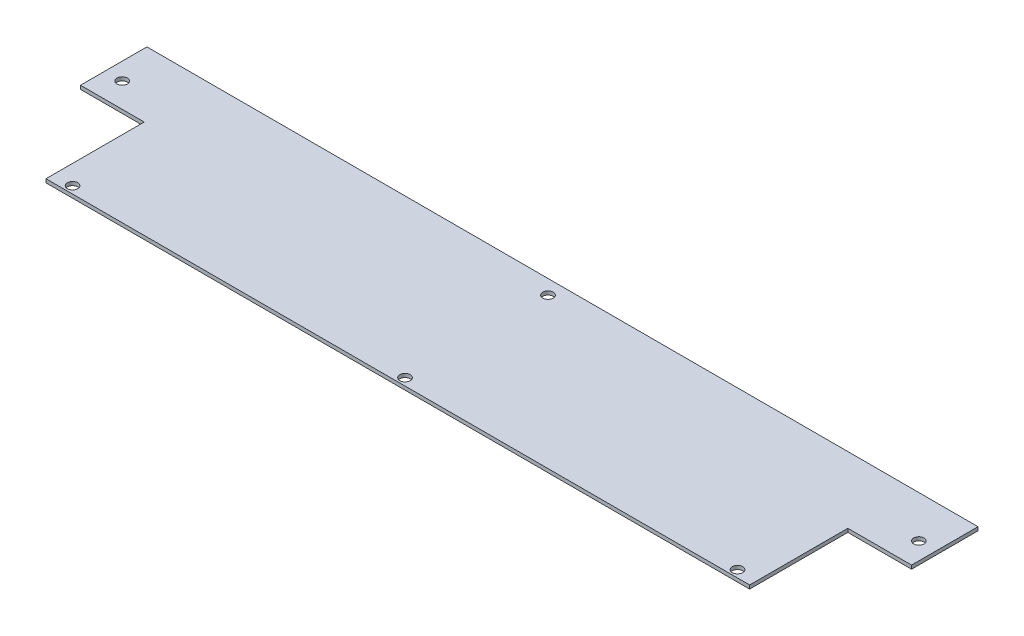
ISO-10303-21;
HEADER;
FILE_DESCRIPTION(('STEP AP214'),'2;1');
FILE_NAME('part.step','',(''),(''),'','','');
FILE_SCHEMA(('AUTOMOTIVE_DESIGN { 1 0 10303 214 1 1 1 1 }'));
ENDSEC;
DATA;
#1=APPLICATION_CONTEXT('core data for automotive mechanical design processes');
#2=APPLICATION_PROTOCOL_DEFINITION('international standard','automotive_design',2000,#1);
#3=PRODUCT_CONTEXT('',#1,'mechanical');
#4=PRODUCT('Part','Part','',(#3));
#5=PRODUCT_RELATED_PRODUCT_CATEGORY('part','',(#4));
#6=PRODUCT_DEFINITION_FORMATION('','',#4);
#7=PRODUCT_DEFINITION_CONTEXT('part definition',#1,'design');
#8=PRODUCT_DEFINITION('design','',#6,#7);
#9=PRODUCT_DEFINITION_SHAPE('','',#8);
#10=(LENGTH_UNIT() NAMED_UNIT(*) SI_UNIT(.MILLI.,.METRE.));
#11=(NAMED_UNIT(*) PLANE_ANGLE_UNIT() SI_UNIT($,.RADIAN.));
#12=(NAMED_UNIT(*) SI_UNIT($,.STERADIAN.) SOLID_ANGLE_UNIT());
#13=UNCERTAINTY_MEASURE_WITH_UNIT(LENGTH_MEASURE(1.E-05),#10,'distance_accuracy_value','');
#14=(GEOMETRIC_REPRESENTATION_CONTEXT(3) GLOBAL_UNCERTAINTY_ASSIGNED_CONTEXT((#13)) GLOBAL_UNIT_ASSIGNED_CONTEXT((#10,
#11,#12)) REPRESENTATION_CONTEXT('',''));
#15=CARTESIAN_POINT('',(0.,0.,0.));
#16=DIRECTION('',(0.,0.,1.));
#17=DIRECTION('',(1.,0.,0.));
#18=AXIS2_PLACEMENT_3D('',#15,#16,#17);
#19=CARTESIAN_POINT('',(0.,1.5875,0.));
#20=DIRECTION('',(0.,-1.,0.));
#21=DIRECTION('',(0.,0.,-1.));
#22=AXIS2_PLACEMENT_3D('',#19,#20,#21);
#23=PLANE('',#22);
#24=DIRECTION('',(0.,0.,1.));
#25=VECTOR('',#24,1.);
#26=CARTESIAN_POINT('',(-182.708271591409,1.5875,-36.195));
#27=LINE('',#26,#25);
#28=CARTESIAN_POINT('',(-182.708271591409,1.5875,-36.195));
#29=VERTEX_POINT('',#28);
#30=CARTESIAN_POINT('',(-182.708271591409,1.5875,-6.98499999999999));
#31=VERTEX_POINT('',#30);
#32=EDGE_CURVE('E168',#29,#31,#27,.T.);
#33=ORIENTED_EDGE('',*,*,#32,.T.);
#34=DIRECTION('',(1.,0.,0.));
#35=VECTOR('',#34,1.);
#36=CARTESIAN_POINT('',(-154.686,1.5875,-6.98499999999999));
#37=LINE('',#36,#35);
#38=CARTESIAN_POINT('',(-154.686,1.5875,-6.98499999999999));
#39=VERTEX_POINT('',#38);
#40=EDGE_CURVE('E104',#31,#39,#37,.T.);
#41=ORIENTED_EDGE('',*,*,#40,.T.);
#42=DIRECTION('',(0.,0.,1.));
#43=VECTOR('',#42,1.);
#44=CARTESIAN_POINT('',(-154.686,1.5875,36.195));
#45=LINE('',#44,#43);
#46=CARTESIAN_POINT('',(-154.686,1.5875,36.195));
#47=VERTEX_POINT('',#46);
#48=EDGE_CURVE('E189',#39,#47,#45,.T.);
#49=ORIENTED_EDGE('',*,*,#48,.T.);
#50=DIRECTION('',(1.,0.,0.));
#51=VECTOR('',#50,1.);
#52=CARTESIAN_POINT('',(154.686,1.5875,36.195));
#53=LINE('',#52,#51);
#54=CARTESIAN_POINT('',(154.686,1.5875,36.195));
#55=VERTEX_POINT('',#54);
#56=EDGE_CURVE('E203',#47,#55,#53,.T.);
#57=ORIENTED_EDGE('',*,*,#56,.T.);
#58=DIRECTION('',(0.,0.,-1.));
#59=VECTOR('',#58,1.);
#60=CARTESIAN_POINT('',(154.686,1.5875,36.195));
#61=LINE('',#60,#59);
#62=CARTESIAN_POINT('',(154.686,1.5875,-6.98499999999999));
#63=VERTEX_POINT('',#62);
#64=EDGE_CURVE('E123',#55,#63,#61,.T.);
#65=ORIENTED_EDGE('',*,*,#64,.T.);
#66=DIRECTION('',(1.,0.,0.));
#67=VECTOR('',#66,1.);
#68=CARTESIAN_POINT('',(182.70827159141,1.5875,-6.98499999999999));
#69=LINE('',#68,#67);
#70=CARTESIAN_POINT('',(182.70827159141,1.5875,-6.98499999999999));
#71=VERTEX_POINT('',#70);
#72=EDGE_CURVE('E117',#63,#71,#69,.T.);
#73=ORIENTED_EDGE('',*,*,#72,.T.);
#74=DIRECTION('',(0.,0.,-1.));
#75=VECTOR('',#74,1.);
#76=CARTESIAN_POINT('',(182.70827159141,1.5875,-36.1950000000001));
#77=LINE('',#76,#75);
#78=CARTESIAN_POINT('',(182.70827159141,1.5875,-36.1950000000001));
#79=VERTEX_POINT('',#78);
#80=EDGE_CURVE('E121',#71,#79,#77,.T.);
#81=ORIENTED_EDGE('',*,*,#80,.T.);
#82=DIRECTION('',(-1.,0.,0.));
#83=VECTOR('',#82,1.);
#84=CARTESIAN_POINT('',(-182.708271591409,1.5875,-36.195));
#85=LINE('',#84,#83);
#86=EDGE_CURVE('E61',#79,#29,#85,.T.);
#87=ORIENTED_EDGE('',*,*,#86,.T.);
#88=EDGE_LOOP('',(#33,#41,#49,#57,#65,#73,#81,#87));
#89=FACE_BOUND('',#88,.T.);
#90=CARTESIAN_POINT('',(175.1457,1.5875,-17.7800000000001));
#91=DIRECTION('',(0.,1.,0.));
#92=DIRECTION('',(0.,0.,1.));
#93=AXIS2_PLACEMENT_3D('',#90,#91,#92);
#94=CIRCLE('',#93,2.28600000000001);
#95=CARTESIAN_POINT('',(175.1457,1.5875,-15.494));
#96=VERTEX_POINT('',#95);
#97=EDGE_CURVE('E150',#96,#96,#94,.T.);
#98=ORIENTED_EDGE('',*,*,#97,.F.);
#99=EDGE_LOOP('',(#98));
#100=FACE_BOUND('',#99,.T.);
#101=CARTESIAN_POINT('',(0.,1.5875,-29.845));
#102=DIRECTION('',(0.,1.,0.));
#103=DIRECTION('',(0.,0.,1.));
#104=AXIS2_PLACEMENT_3D('',#101,#102,#103);
#105=CIRCLE('',#104,2.28599999999997);
#106=CARTESIAN_POINT('',(0.,1.5875,-27.559));
#107=VERTEX_POINT('',#106);
#108=EDGE_CURVE('E217',#107,#107,#105,.T.);
#109=ORIENTED_EDGE('',*,*,#108,.F.);
#110=EDGE_LOOP('',(#109));
#111=FACE_BOUND('',#110,.T.);
#112=CARTESIAN_POINT('',(-175.1457,1.5875,-17.78));
#113=DIRECTION('',(0.,1.,0.));
#114=DIRECTION('',(0.,0.,1.));
#115=AXIS2_PLACEMENT_3D('',#112,#113,#114);
#116=CIRCLE('',#115,2.28600000000001);
#117=CARTESIAN_POINT('',(-175.1457,1.5875,-15.494));
#118=VERTEX_POINT('',#117);
#119=EDGE_CURVE('E225',#118,#118,#116,.T.);
#120=ORIENTED_EDGE('',*,*,#119,.F.);
#121=EDGE_LOOP('',(#120));
#122=FACE_BOUND('',#121,.T.);
#123=CARTESIAN_POINT('',(0.,1.5875,33.02));
#124=DIRECTION('',(0.,1.,0.));
#125=DIRECTION('',(0.,0.,1.));
#126=AXIS2_PLACEMENT_3D('',#123,#124,#125);
#127=CIRCLE('',#126,2.28599999999998);
#128=CARTESIAN_POINT('',(0.,1.5875,35.306));
#129=VERTEX_POINT('',#128);
#130=EDGE_CURVE('E233',#129,#129,#127,.T.);
#131=ORIENTED_EDGE('',*,*,#130,.F.);
#132=EDGE_LOOP('',(#131));
#133=FACE_BOUND('',#132,.T.);
#134=CARTESIAN_POINT('',(-146.177,1.5875,33.02));
#135=DIRECTION('',(0.,1.,0.));
#136=DIRECTION('',(0.,0.,1.));
#137=AXIS2_PLACEMENT_3D('',#134,#135,#136);
#138=CIRCLE('',#137,2.28600000000001);
#139=CARTESIAN_POINT('',(-146.177,1.5875,35.306));
#140=VERTEX_POINT('',#139);
#141=EDGE_CURVE('E241',#140,#140,#138,.T.);
#142=ORIENTED_EDGE('',*,*,#141,.F.);
#143=EDGE_LOOP('',(#142));
#144=FACE_BOUND('',#143,.T.);
#145=CARTESIAN_POINT('',(146.177,1.5875,33.02));
#146=DIRECTION('',(0.,1.,0.));
#147=DIRECTION('',(0.,0.,1.));
#148=AXIS2_PLACEMENT_3D('',#145,#146,#147);
#149=CIRCLE('',#148,2.28600000000001);
#150=CARTESIAN_POINT('',(146.177,1.5875,35.306));
#151=VERTEX_POINT('',#150);
#152=EDGE_CURVE('E249',#151,#151,#149,.T.);
#153=ORIENTED_EDGE('',*,*,#152,.F.);
#154=EDGE_LOOP('',(#153));
#155=FACE_BOUND('',#154,.T.);
#156=ADVANCED_FACE('F43',(#89,#100,#111,#122,#133,#144,#155),#23,.F.);
#157=CARTESIAN_POINT('',(0.,0.,0.));
#158=DIRECTION('',(0.,-1.,0.));
#159=DIRECTION('',(0.,0.,-1.));
#160=AXIS2_PLACEMENT_3D('',#157,#158,#159);
#161=PLANE('',#160);
#162=CARTESIAN_POINT('',(-146.177,0.,33.02));
#163=DIRECTION('',(0.,1.,0.));
#164=DIRECTION('',(0.,0.,1.));
#165=AXIS2_PLACEMENT_3D('',#162,#163,#164);
#166=CIRCLE('',#165,2.28600000000001);
#167=CARTESIAN_POINT('',(-146.177,0.,35.306));
#168=VERTEX_POINT('',#167);
#169=EDGE_CURVE('E245',#168,#168,#166,.T.);
#170=ORIENTED_EDGE('',*,*,#169,.T.);
#171=EDGE_LOOP('',(#170));
#172=FACE_BOUND('',#171,.T.);
#173=CARTESIAN_POINT('',(-175.1457,0.,-17.78));
#174=DIRECTION('',(0.,1.,0.));
#175=DIRECTION('',(0.,0.,1.));
#176=AXIS2_PLACEMENT_3D('',#173,#174,#175);
#177=CIRCLE('',#176,2.28600000000001);
#178=CARTESIAN_POINT('',(-175.1457,0.,-15.494));
#179=VERTEX_POINT('',#178);
#180=EDGE_CURVE('E229',#179,#179,#177,.T.);
#181=ORIENTED_EDGE('',*,*,#180,.T.);
#182=EDGE_LOOP('',(#181));
#183=FACE_BOUND('',#182,.T.);
#184=CARTESIAN_POINT('',(175.1457,0.,-17.7800000000001));
#185=DIRECTION('',(0.,1.,0.));
#186=DIRECTION('',(0.,0.,1.));
#187=AXIS2_PLACEMENT_3D('',#184,#185,#186);
#188=CIRCLE('',#187,2.28600000000001);
#189=CARTESIAN_POINT('',(175.1457,0.,-15.494));
#190=VERTEX_POINT('',#189);
#191=EDGE_CURVE('E213',#190,#190,#188,.T.);
#192=ORIENTED_EDGE('',*,*,#191,.T.);
#193=EDGE_LOOP('',(#192));
#194=FACE_BOUND('',#193,.T.);
#195=DIRECTION('',(0.,0.,1.));
#196=VECTOR('',#195,1.);
#197=CARTESIAN_POINT('',(-182.708271591409,0.,-36.195));
#198=LINE('',#197,#196);
#199=CARTESIAN_POINT('',(-182.708271591409,0.,-36.195));
#200=VERTEX_POINT('',#199);
#201=CARTESIAN_POINT('',(-182.708271591409,0.,-6.98499999999999));
#202=VERTEX_POINT('',#201);
#203=EDGE_CURVE('E145',#200,#202,#198,.T.);
#204=ORIENTED_EDGE('',*,*,#203,.F.);
#205=DIRECTION('',(-1.,0.,0.));
#206=VECTOR('',#205,1.);
#207=CARTESIAN_POINT('',(-182.708271591409,0.,-36.195));
#208=LINE('',#207,#206);
#209=CARTESIAN_POINT('',(182.70827159141,0.,-36.1950000000001));
#210=VERTEX_POINT('',#209);
#211=EDGE_CURVE('E96',#210,#200,#208,.T.);
#212=ORIENTED_EDGE('',*,*,#211,.F.);
#213=DIRECTION('',(0.,0.,-1.));
#214=VECTOR('',#213,1.);
#215=CARTESIAN_POINT('',(182.70827159141,0.,-36.1950000000001));
#216=LINE('',#215,#214);
#217=CARTESIAN_POINT('',(182.70827159141,0.,-6.98499999999999));
#218=VERTEX_POINT('',#217);
#219=EDGE_CURVE('E90',#218,#210,#216,.T.);
#220=ORIENTED_EDGE('',*,*,#219,.F.);
#221=DIRECTION('',(1.,0.,0.));
#222=VECTOR('',#221,1.);
#223=CARTESIAN_POINT('',(182.70827159141,0.,-6.98499999999999));
#224=LINE('',#223,#222);
#225=CARTESIAN_POINT('',(154.686,0.,-6.98499999999999));
#226=VERTEX_POINT('',#225);
#227=EDGE_CURVE('E132',#226,#218,#224,.T.);
#228=ORIENTED_EDGE('',*,*,#227,.F.);
#229=DIRECTION('',(0.,0.,-1.));
#230=VECTOR('',#229,1.);
#231=CARTESIAN_POINT('',(154.686,0.,36.195));
#232=LINE('',#231,#230);
#233=CARTESIAN_POINT('',(154.686,0.,36.195));
#234=VERTEX_POINT('',#233);
#235=EDGE_CURVE('E159',#234,#226,#232,.T.);
#236=ORIENTED_EDGE('',*,*,#235,.F.);
#237=DIRECTION('',(1.,0.,0.));
#238=VECTOR('',#237,1.);
#239=CARTESIAN_POINT('',(154.686,0.,36.195));
#240=LINE('',#239,#238);
#241=CARTESIAN_POINT('',(-154.686,0.,36.195));
#242=VERTEX_POINT('',#241);
#243=EDGE_CURVE('E156',#242,#234,#240,.T.);
#244=ORIENTED_EDGE('',*,*,#243,.F.);
#245=DIRECTION('',(0.,0.,1.));
#246=VECTOR('',#245,1.);
#247=CARTESIAN_POINT('',(-154.686,0.,36.195));
#248=LINE('',#247,#246);
#249=CARTESIAN_POINT('',(-154.686,0.,-6.98499999999999));
#250=VERTEX_POINT('',#249);
#251=EDGE_CURVE('E153',#250,#242,#248,.T.);
#252=ORIENTED_EDGE('',*,*,#251,.F.);
#253=DIRECTION('',(1.,0.,0.));
#254=VECTOR('',#253,1.);
#255=CARTESIAN_POINT('',(-154.686,0.,-6.98499999999999));
#256=LINE('',#255,#254);
#257=EDGE_CURVE('E149',#202,#250,#256,.T.);
#258=ORIENTED_EDGE('',*,*,#257,.F.);
#259=EDGE_LOOP('',(#204,#212,#220,#228,#236,#244,#252,#258));
#260=FACE_BOUND('',#259,.T.);
#261=CARTESIAN_POINT('',(0.,0.,-29.845));
#262=DIRECTION('',(0.,1.,0.));
#263=DIRECTION('',(0.,0.,1.));
#264=AXIS2_PLACEMENT_3D('',#261,#262,#263);
#265=CIRCLE('',#264,2.28599999999997);
#266=CARTESIAN_POINT('',(0.,0.,-27.559));
#267=VERTEX_POINT('',#266);
#268=EDGE_CURVE('E221',#267,#267,#265,.T.);
#269=ORIENTED_EDGE('',*,*,#268,.T.);
#270=EDGE_LOOP('',(#269));
#271=FACE_BOUND('',#270,.T.);
#272=CARTESIAN_POINT('',(0.,0.,33.02));
#273=DIRECTION('',(0.,1.,0.));
#274=DIRECTION('',(0.,0.,1.));
#275=AXIS2_PLACEMENT_3D('',#272,#273,#274);
#276=CIRCLE('',#275,2.28599999999998);
#277=CARTESIAN_POINT('',(0.,0.,35.306));
#278=VERTEX_POINT('',#277);
#279=EDGE_CURVE('E237',#278,#278,#276,.T.);
#280=ORIENTED_EDGE('',*,*,#279,.T.);
#281=EDGE_LOOP('',(#280));
#282=FACE_BOUND('',#281,.T.);
#283=CARTESIAN_POINT('',(146.177,0.,33.02));
#284=DIRECTION('',(0.,1.,0.));
#285=DIRECTION('',(0.,0.,1.));
#286=AXIS2_PLACEMENT_3D('',#283,#284,#285);
#287=CIRCLE('',#286,2.28600000000001);
#288=CARTESIAN_POINT('',(146.177,0.,35.306));
#289=VERTEX_POINT('',#288);
#290=EDGE_CURVE('E253',#289,#289,#287,.T.);
#291=ORIENTED_EDGE('',*,*,#290,.T.);
#292=EDGE_LOOP('',(#291));
#293=FACE_BOUND('',#292,.T.);
#294=ADVANCED_FACE('F193',(#172,#183,#194,#260,#271,#282,#293),#161,.T.);
#295=CARTESIAN_POINT('',(-182.708271591409,1.5875,-36.195));
#296=DIRECTION('',(1.,0.,0.));
#297=DIRECTION('',(0.,0.,-1.));
#298=AXIS2_PLACEMENT_3D('',#295,#296,#297);
#299=PLANE('',#298);
#300=ORIENTED_EDGE('',*,*,#203,.T.);
#301=DIRECTION('',(0.,-1.,0.));
#302=VECTOR('',#301,1.);
#303=CARTESIAN_POINT('',(-182.708271591409,1.5875,-6.98499999999999));
#304=LINE('',#303,#302);
#305=EDGE_CURVE('E11',#31,#202,#304,.T.);
#306=ORIENTED_EDGE('',*,*,#305,.F.);
#307=ORIENTED_EDGE('',*,*,#32,.F.);
#308=DIRECTION('',(0.,-1.,0.));
#309=VECTOR('',#308,1.);
#310=CARTESIAN_POINT('',(-182.708271591409,1.5875,-36.195));
#311=LINE('',#310,#309);
#312=EDGE_CURVE('E141',#29,#200,#311,.T.);
#313=ORIENTED_EDGE('',*,*,#312,.T.);
#314=EDGE_LOOP('',(#300,#306,#307,#313));
#315=FACE_BOUND('',#314,.T.);
#316=ADVANCED_FACE('F45',(#315),#299,.F.);
#317=CARTESIAN_POINT('',(-154.686,1.5875,-6.98499999999999));
#318=DIRECTION('',(0.,0.,-1.));
#319=DIRECTION('',(-1.,0.,0.));
#320=AXIS2_PLACEMENT_3D('',#317,#318,#319);
#321=PLANE('',#320);
#322=ORIENTED_EDGE('',*,*,#257,.T.);
#323=DIRECTION('',(0.,-1.,0.));
#324=VECTOR('',#323,1.);
#325=CARTESIAN_POINT('',(-154.686,1.5875,-6.98499999999999));
#326=LINE('',#325,#324);
#327=EDGE_CURVE('E53',#39,#250,#326,.T.);
#328=ORIENTED_EDGE('',*,*,#327,.F.);
#329=ORIENTED_EDGE('',*,*,#40,.F.);
#330=ORIENTED_EDGE('',*,*,#305,.T.);
#331=EDGE_LOOP('',(#322,#328,#329,#330));
#332=FACE_BOUND('',#331,.T.);
#333=ADVANCED_FACE('F287',(#332),#321,.F.);
#334=CARTESIAN_POINT('',(-154.686,1.5875,36.195));
#335=DIRECTION('',(1.,0.,0.));
#336=DIRECTION('',(0.,0.,-1.));
#337=AXIS2_PLACEMENT_3D('',#334,#335,#336);
#338=PLANE('',#337);
#339=ORIENTED_EDGE('',*,*,#251,.T.);
#340=DIRECTION('',(0.,-1.,0.));
#341=VECTOR('',#340,1.);
#342=CARTESIAN_POINT('',(-154.686,1.5875,36.195));
#343=LINE('',#342,#341);
#344=EDGE_CURVE('E179',#47,#242,#343,.T.);
#345=ORIENTED_EDGE('',*,*,#344,.F.);
#346=ORIENTED_EDGE('',*,*,#48,.F.);
#347=ORIENTED_EDGE('',*,*,#327,.T.);
#348=EDGE_LOOP('',(#339,#345,#346,#347));
#349=FACE_BOUND('',#348,.T.);
#350=ADVANCED_FACE('F187',(#349),#338,.F.);
#351=CARTESIAN_POINT('',(154.686,1.5875,36.195));
#352=DIRECTION('',(0.,0.,-1.));
#353=DIRECTION('',(-1.,0.,0.));
#354=AXIS2_PLACEMENT_3D('',#351,#352,#353);
#355=PLANE('',#354);
#356=ORIENTED_EDGE('',*,*,#243,.T.);
#357=DIRECTION('',(0.,-1.,0.));
#358=VECTOR('',#357,1.);
#359=CARTESIAN_POINT('',(154.686,1.5875,36.195));
#360=LINE('',#359,#358);
#361=EDGE_CURVE('E175',#55,#234,#360,.T.);
#362=ORIENTED_EDGE('',*,*,#361,.F.);
#363=ORIENTED_EDGE('',*,*,#56,.F.);
#364=ORIENTED_EDGE('',*,*,#344,.T.);
#365=EDGE_LOOP('',(#356,#362,#363,#364));
#366=FACE_BOUND('',#365,.T.);
#367=ADVANCED_FACE('F198',(#366),#355,.F.);
#368=CARTESIAN_POINT('',(154.686,1.5875,36.195));
#369=DIRECTION('',(-1.,0.,0.));
#370=DIRECTION('',(0.,0.,1.));
#371=AXIS2_PLACEMENT_3D('',#368,#369,#370);
#372=PLANE('',#371);
#373=ORIENTED_EDGE('',*,*,#235,.T.);
#374=DIRECTION('',(0.,-1.,0.));
#375=VECTOR('',#374,1.);
#376=CARTESIAN_POINT('',(154.686,1.5875,-6.98499999999999));
#377=LINE('',#376,#375);
#378=EDGE_CURVE('E134',#63,#226,#377,.T.);
#379=ORIENTED_EDGE('',*,*,#378,.F.);
#380=ORIENTED_EDGE('',*,*,#64,.F.);
#381=ORIENTED_EDGE('',*,*,#361,.T.);
#382=EDGE_LOOP('',(#373,#379,#380,#381));
#383=FACE_BOUND('',#382,.T.);
#384=ADVANCED_FACE('F201',(#383),#372,.F.);
#385=CARTESIAN_POINT('',(182.70827159141,1.5875,-6.98499999999999));
#386=DIRECTION('',(0.,0.,-1.));
#387=DIRECTION('',(-1.,0.,0.));
#388=AXIS2_PLACEMENT_3D('',#385,#386,#387);
#389=PLANE('',#388);
#390=ORIENTED_EDGE('',*,*,#227,.T.);
#391=DIRECTION('',(0.,-1.,0.));
#392=VECTOR('',#391,1.);
#393=CARTESIAN_POINT('',(182.70827159141,1.5875,-6.98499999999999));
#394=LINE('',#393,#392);
#395=EDGE_CURVE('E129',#71,#218,#394,.T.);
#396=ORIENTED_EDGE('',*,*,#395,.F.);
#397=ORIENTED_EDGE('',*,*,#72,.F.);
#398=ORIENTED_EDGE('',*,*,#378,.T.);
#399=EDGE_LOOP('',(#390,#396,#397,#398));
#400=FACE_BOUND('',#399,.T.);
#401=ADVANCED_FACE('F130',(#400),#389,.F.);
#402=CARTESIAN_POINT('',(182.70827159141,1.5875,-36.1950000000001));
#403=DIRECTION('',(-1.,0.,0.));
#404=DIRECTION('',(0.,0.,1.));
#405=AXIS2_PLACEMENT_3D('',#402,#403,#404);
#406=PLANE('',#405);
#407=ORIENTED_EDGE('',*,*,#219,.T.);
#408=DIRECTION('',(0.,-1.,0.));
#409=VECTOR('',#408,1.);
#410=CARTESIAN_POINT('',(182.70827159141,1.5875,-36.1950000000001));
#411=LINE('',#410,#409);
#412=EDGE_CURVE('E135',#79,#210,#411,.T.);
#413=ORIENTED_EDGE('',*,*,#412,.F.);
#414=ORIENTED_EDGE('',*,*,#80,.F.);
#415=ORIENTED_EDGE('',*,*,#395,.T.);
#416=EDGE_LOOP('',(#407,#413,#414,#415));
#417=FACE_BOUND('',#416,.T.);
#418=ADVANCED_FACE('F137',(#417),#406,.F.);
#419=CARTESIAN_POINT('',(-182.708271591409,1.5875,-36.195));
#420=DIRECTION('',(0.,0.,1.));
#421=DIRECTION('',(1.,0.,0.));
#422=AXIS2_PLACEMENT_3D('',#419,#420,#421);
#423=PLANE('',#422);
#424=ORIENTED_EDGE('',*,*,#211,.T.);
#425=ORIENTED_EDGE('',*,*,#312,.F.);
#426=ORIENTED_EDGE('',*,*,#86,.F.);
#427=ORIENTED_EDGE('',*,*,#412,.T.);
#428=EDGE_LOOP('',(#424,#425,#426,#427));
#429=FACE_BOUND('',#428,.T.);
#430=ADVANCED_FACE('F275',(#429),#423,.F.);
#431=CARTESIAN_POINT('',(175.1457,1.5875,-17.7800000000001));
#432=DIRECTION('',(0.,-1.,0.));
#433=DIRECTION('',(0.,0.,-1.));
#434=AXIS2_PLACEMENT_3D('',#431,#432,#433);
#435=CYLINDRICAL_SURFACE('',#434,2.28600000000001);
#436=ORIENTED_EDGE('',*,*,#97,.T.);
#437=EDGE_LOOP('',(#436));
#438=FACE_BOUND('',#437,.T.);
#439=ORIENTED_EDGE('',*,*,#191,.F.);
#440=EDGE_LOOP('',(#439));
#441=FACE_BOUND('',#440,.T.);
#442=ADVANCED_FACE('F272',(#438,#441),#435,.F.);
#443=CARTESIAN_POINT('',(0.,1.5875,-29.845));
#444=DIRECTION('',(0.,-1.,0.));
#445=DIRECTION('',(0.,0.,-1.));
#446=AXIS2_PLACEMENT_3D('',#443,#444,#445);
#447=CYLINDRICAL_SURFACE('',#446,2.28599999999997);
#448=ORIENTED_EDGE('',*,*,#108,.T.);
#449=EDGE_LOOP('',(#448));
#450=FACE_BOUND('',#449,.T.);
#451=ORIENTED_EDGE('',*,*,#268,.F.);
#452=EDGE_LOOP('',(#451));
#453=FACE_BOUND('',#452,.T.);
#454=ADVANCED_FACE('F363',(#450,#453),#447,.F.);
#455=CARTESIAN_POINT('',(-175.1457,1.5875,-17.78));
#456=DIRECTION('',(0.,-1.,0.));
#457=DIRECTION('',(0.,0.,-1.));
#458=AXIS2_PLACEMENT_3D('',#455,#456,#457);
#459=CYLINDRICAL_SURFACE('',#458,2.28600000000001);
#460=ORIENTED_EDGE('',*,*,#119,.T.);
#461=EDGE_LOOP('',(#460));
#462=FACE_BOUND('',#461,.T.);
#463=ORIENTED_EDGE('',*,*,#180,.F.);
#464=EDGE_LOOP('',(#463));
#465=FACE_BOUND('',#464,.T.);
#466=ADVANCED_FACE('F372',(#462,#465),#459,.F.);
#467=CARTESIAN_POINT('',(0.,1.5875,33.02));
#468=DIRECTION('',(0.,-1.,0.));
#469=DIRECTION('',(0.,0.,-1.));
#470=AXIS2_PLACEMENT_3D('',#467,#468,#469);
#471=CYLINDRICAL_SURFACE('',#470,2.28599999999998);
#472=ORIENTED_EDGE('',*,*,#130,.T.);
#473=EDGE_LOOP('',(#472));
#474=FACE_BOUND('',#473,.T.);
#475=ORIENTED_EDGE('',*,*,#279,.F.);
#476=EDGE_LOOP('',(#475));
#477=FACE_BOUND('',#476,.T.);
#478=ADVANCED_FACE('F381',(#474,#477),#471,.F.);
#479=CARTESIAN_POINT('',(-146.177,1.5875,33.02));
#480=DIRECTION('',(0.,-1.,0.));
#481=DIRECTION('',(0.,0.,-1.));
#482=AXIS2_PLACEMENT_3D('',#479,#480,#481);
#483=CYLINDRICAL_SURFACE('',#482,2.28600000000001);
#484=ORIENTED_EDGE('',*,*,#141,.T.);
#485=EDGE_LOOP('',(#484));
#486=FACE_BOUND('',#485,.T.);
#487=ORIENTED_EDGE('',*,*,#169,.F.);
#488=EDGE_LOOP('',(#487));
#489=FACE_BOUND('',#488,.T.);
#490=ADVANCED_FACE('F391',(#486,#489),#483,.F.);
#491=CARTESIAN_POINT('',(146.177,1.5875,33.02));
#492=DIRECTION('',(0.,-1.,0.));
#493=DIRECTION('',(0.,0.,-1.));
#494=AXIS2_PLACEMENT_3D('',#491,#492,#493);
#495=CYLINDRICAL_SURFACE('',#494,2.28600000000001);
#496=ORIENTED_EDGE('',*,*,#152,.T.);
#497=EDGE_LOOP('',(#496));
#498=FACE_BOUND('',#497,.T.);
#499=ORIENTED_EDGE('',*,*,#290,.F.);
#500=EDGE_LOOP('',(#499));
#501=FACE_BOUND('',#500,.T.);
#502=ADVANCED_FACE('F261',(#498,#501),#495,.F.);
#503=CLOSED_SHELL('',(#156,#294,#316,#333,#350,#367,#384,#401,#418,#430,#442,#454,#466,#478,
#490,#502));
#504=MANIFOLD_SOLID_BREP('B2',#503);
#505=ADVANCED_BREP_SHAPE_REPRESENTATION('',(#18,#504),#14);
#506=SHAPE_DEFINITION_REPRESENTATION(#9,#505);
ENDSEC;
END-ISO-10303-21;
